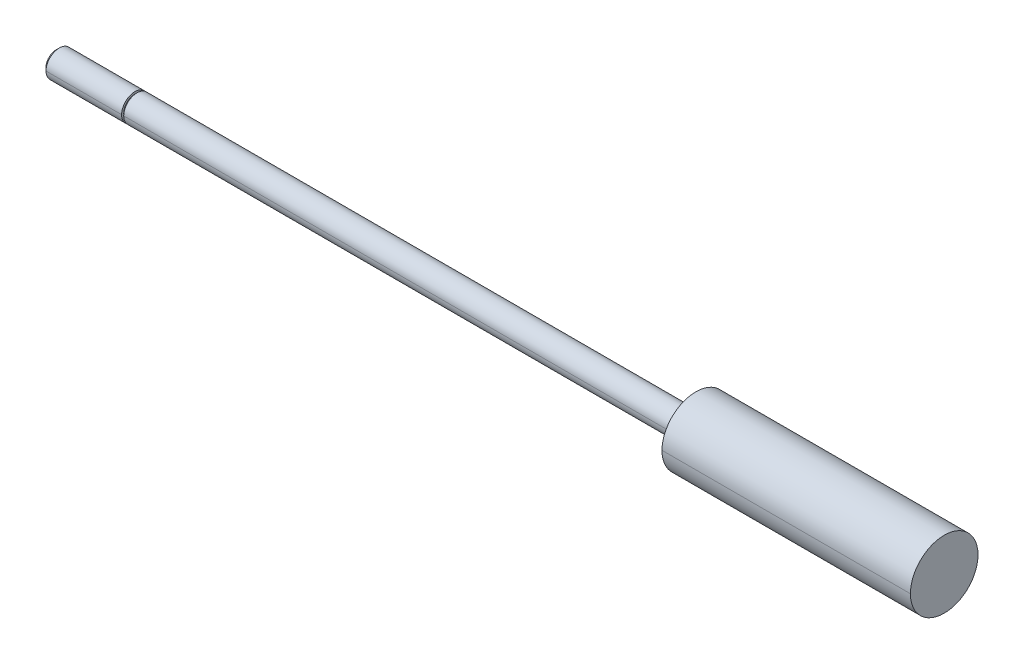
ISO-10303-21;
HEADER;
FILE_DESCRIPTION(('STEP AP214'),'2;1');
FILE_NAME('part.step','',(''),(''),'','','');
FILE_SCHEMA(('AUTOMOTIVE_DESIGN { 1 0 10303 214 1 1 1 1 }'));
ENDSEC;
DATA;
#1=APPLICATION_CONTEXT('core data for automotive mechanical design processes');
#2=APPLICATION_PROTOCOL_DEFINITION('international standard','automotive_design',2000,#1);
#3=PRODUCT_CONTEXT('',#1,'mechanical');
#4=PRODUCT('Part','Part','',(#3));
#5=PRODUCT_RELATED_PRODUCT_CATEGORY('part','',(#4));
#6=PRODUCT_DEFINITION_FORMATION('','',#4);
#7=PRODUCT_DEFINITION_CONTEXT('part definition',#1,'design');
#8=PRODUCT_DEFINITION('design','',#6,#7);
#9=PRODUCT_DEFINITION_SHAPE('','',#8);
#10=(LENGTH_UNIT() NAMED_UNIT(*) SI_UNIT(.MILLI.,.METRE.));
#11=(NAMED_UNIT(*) PLANE_ANGLE_UNIT() SI_UNIT($,.RADIAN.));
#12=(NAMED_UNIT(*) SI_UNIT($,.STERADIAN.) SOLID_ANGLE_UNIT());
#13=UNCERTAINTY_MEASURE_WITH_UNIT(LENGTH_MEASURE(1.E-05),#10,'distance_accuracy_value','');
#14=(GEOMETRIC_REPRESENTATION_CONTEXT(3) GLOBAL_UNCERTAINTY_ASSIGNED_CONTEXT((#13)) GLOBAL_UNIT_ASSIGNED_CONTEXT((#10,
#11,#12)) REPRESENTATION_CONTEXT('',''));
#15=CARTESIAN_POINT('',(0.,0.,0.));
#16=DIRECTION('',(0.,0.,1.));
#17=DIRECTION('',(1.,0.,0.));
#18=AXIS2_PLACEMENT_3D('',#15,#16,#17);
#19=CARTESIAN_POINT('',(0.,0.,0.));
#20=DIRECTION('',(-1.,0.,0.));
#21=DIRECTION('',(0.,-1.,0.));
#22=AXIS2_PLACEMENT_3D('',#19,#20,#21);
#23=CYLINDRICAL_SURFACE('',#22,1.3335);
#24=CARTESIAN_POINT('',(0.,0.,0.));
#25=DIRECTION('',(1.,0.,0.));
#26=DIRECTION('',(0.,0.,-1.));
#27=AXIS2_PLACEMENT_3D('',#24,#25,#26);
#28=CIRCLE('',#27,1.3335);
#29=CARTESIAN_POINT('',(0.,0.,-1.3335));
#30=VERTEX_POINT('',#29);
#31=CARTESIAN_POINT('',(0.,0.,1.3335));
#32=VERTEX_POINT('',#31);
#33=EDGE_CURVE('E11',#30,#32,#28,.T.);
#34=ORIENTED_EDGE('',*,*,#33,.F.);
#35=DIRECTION('',(-1.,0.,0.));
#36=VECTOR('',#35,1.);
#37=CARTESIAN_POINT('',(0.,0.,-1.3335));
#38=LINE('',#37,#36);
#39=CARTESIAN_POINT('',(-0.254,0.,-1.3335));
#40=VERTEX_POINT('',#39);
#41=EDGE_CURVE('E24',#30,#40,#38,.T.);
#42=ORIENTED_EDGE('',*,*,#41,.T.);
#43=CARTESIAN_POINT('',(-0.254,0.,0.));
#44=DIRECTION('',(1.,0.,0.));
#45=DIRECTION('',(0.,0.,-1.));
#46=AXIS2_PLACEMENT_3D('',#43,#44,#45);
#47=CIRCLE('',#46,1.3335);
#48=CARTESIAN_POINT('',(-0.254,0.,1.3335));
#49=VERTEX_POINT('',#48);
#50=EDGE_CURVE('E210',#40,#49,#47,.T.);
#51=ORIENTED_EDGE('',*,*,#50,.T.);
#52=DIRECTION('',(-1.,0.,0.));
#53=VECTOR('',#52,1.);
#54=CARTESIAN_POINT('',(0.,0.,1.3335));
#55=LINE('',#54,#53);
#56=EDGE_CURVE('E205',#32,#49,#55,.T.);
#57=ORIENTED_EDGE('',*,*,#56,.F.);
#58=EDGE_LOOP('',(#34,#42,#51,#57));
#59=FACE_BOUND('',#58,.T.);
#60=ADVANCED_FACE('F16',(#59),#23,.T.);
#61=CARTESIAN_POINT('',(0.,0.,0.));
#62=DIRECTION('',(-1.,0.,0.));
#63=DIRECTION('',(0.,1.,0.));
#64=AXIS2_PLACEMENT_3D('',#61,#62,#63);
#65=CYLINDRICAL_SURFACE('',#64,1.3335);
#66=CARTESIAN_POINT('',(-0.254,0.,0.));
#67=DIRECTION('',(1.,0.,0.));
#68=DIRECTION('',(0.,0.,-1.));
#69=AXIS2_PLACEMENT_3D('',#66,#67,#68);
#70=CIRCLE('',#69,1.3335);
#71=EDGE_CURVE('E201',#49,#40,#70,.T.);
#72=ORIENTED_EDGE('',*,*,#71,.T.);
#73=ORIENTED_EDGE('',*,*,#41,.F.);
#74=CARTESIAN_POINT('',(0.,0.,0.));
#75=DIRECTION('',(1.,0.,0.));
#76=DIRECTION('',(0.,0.,-1.));
#77=AXIS2_PLACEMENT_3D('',#74,#75,#76);
#78=CIRCLE('',#77,1.3335);
#79=EDGE_CURVE('E196',#32,#30,#78,.T.);
#80=ORIENTED_EDGE('',*,*,#79,.F.);
#81=ORIENTED_EDGE('',*,*,#56,.T.);
#82=EDGE_LOOP('',(#72,#73,#80,#81));
#83=FACE_BOUND('',#82,.T.);
#84=ADVANCED_FACE('F223',(#83),#65,.T.);
#85=CARTESIAN_POINT('',(0.,1.3335,0.));
#86=DIRECTION('',(1.,0.,0.));
#87=DIRECTION('',(0.,0.,-1.));
#88=AXIS2_PLACEMENT_3D('',#85,#86,#87);
#89=PLANE('',#88);
#90=CARTESIAN_POINT('',(0.,0.,0.));
#91=DIRECTION('',(1.,0.,0.));
#92=DIRECTION('',(0.,0.,-1.));
#93=AXIS2_PLACEMENT_3D('',#90,#91,#92);
#94=CIRCLE('',#93,1.5875);
#95=CARTESIAN_POINT('',(0.,0.,-1.5875));
#96=VERTEX_POINT('',#95);
#97=CARTESIAN_POINT('',(0.,0.,1.5875));
#98=VERTEX_POINT('',#97);
#99=EDGE_CURVE('E191',#96,#98,#94,.T.);
#100=ORIENTED_EDGE('',*,*,#99,.F.);
#101=CARTESIAN_POINT('',(0.,0.,0.));
#102=DIRECTION('',(1.,0.,0.));
#103=DIRECTION('',(0.,0.,-1.));
#104=AXIS2_PLACEMENT_3D('',#101,#102,#103);
#105=CIRCLE('',#104,1.5875);
#106=EDGE_CURVE('E186',#98,#96,#105,.T.);
#107=ORIENTED_EDGE('',*,*,#106,.F.);
#108=EDGE_LOOP('',(#100,#107));
#109=FACE_BOUND('',#108,.T.);
#110=ORIENTED_EDGE('',*,*,#33,.T.);
#111=ORIENTED_EDGE('',*,*,#79,.T.);
#112=EDGE_LOOP('',(#110,#111));
#113=FACE_BOUND('',#112,.T.);
#114=ADVANCED_FACE('F248',(#109,#113),#89,.F.);
#115=CARTESIAN_POINT('',(96.3168,0.,0.));
#116=DIRECTION('',(-1.,0.,0.));
#117=DIRECTION('',(0.,1.,0.));
#118=AXIS2_PLACEMENT_3D('',#115,#116,#117);
#119=CYLINDRICAL_SURFACE('',#118,1.5875);
#120=ORIENTED_EDGE('',*,*,#106,.T.);
#121=DIRECTION('',(-1.,0.,0.));
#122=VECTOR('',#121,1.);
#123=CARTESIAN_POINT('',(66.675,0.,-1.5875));
#124=LINE('',#123,#122);
#125=CARTESIAN_POINT('',(66.675,0.,-1.5875));
#126=VERTEX_POINT('',#125);
#127=EDGE_CURVE('E181',#126,#96,#124,.T.);
#128=ORIENTED_EDGE('',*,*,#127,.F.);
#129=CARTESIAN_POINT('',(66.675,0.,0.));
#130=DIRECTION('',(1.,0.,0.));
#131=DIRECTION('',(0.,0.,-1.));
#132=AXIS2_PLACEMENT_3D('',#129,#130,#131);
#133=CIRCLE('',#132,1.5875);
#134=CARTESIAN_POINT('',(66.675,0.,1.5875));
#135=VERTEX_POINT('',#134);
#136=EDGE_CURVE('E176',#135,#126,#133,.T.);
#137=ORIENTED_EDGE('',*,*,#136,.F.);
#138=DIRECTION('',(-1.,0.,0.));
#139=VECTOR('',#138,1.);
#140=CARTESIAN_POINT('',(66.675,0.,1.5875));
#141=LINE('',#140,#139);
#142=EDGE_CURVE('E171',#135,#98,#141,.T.);
#143=ORIENTED_EDGE('',*,*,#142,.T.);
#144=EDGE_LOOP('',(#120,#128,#137,#143));
#145=FACE_BOUND('',#144,.T.);
#146=ADVANCED_FACE('F252',(#145),#119,.T.);
#147=CARTESIAN_POINT('',(96.3168,0.,0.));
#148=DIRECTION('',(-1.,0.,0.));
#149=DIRECTION('',(0.,-1.,0.));
#150=AXIS2_PLACEMENT_3D('',#147,#148,#149);
#151=CYLINDRICAL_SURFACE('',#150,1.5875);
#152=CARTESIAN_POINT('',(66.675,0.,0.));
#153=DIRECTION('',(1.,0.,0.));
#154=DIRECTION('',(0.,0.,-1.));
#155=AXIS2_PLACEMENT_3D('',#152,#153,#154);
#156=CIRCLE('',#155,1.5875);
#157=EDGE_CURVE('E166',#126,#135,#156,.T.);
#158=ORIENTED_EDGE('',*,*,#157,.F.);
#159=ORIENTED_EDGE('',*,*,#127,.T.);
#160=ORIENTED_EDGE('',*,*,#99,.T.);
#161=ORIENTED_EDGE('',*,*,#142,.F.);
#162=EDGE_LOOP('',(#158,#159,#160,#161));
#163=FACE_BOUND('',#162,.T.);
#164=ADVANCED_FACE('F258',(#163),#151,.T.);
#165=CARTESIAN_POINT('',(66.675,1.5875,0.));
#166=DIRECTION('',(1.,0.,0.));
#167=DIRECTION('',(0.,0.,-1.));
#168=AXIS2_PLACEMENT_3D('',#165,#166,#167);
#169=PLANE('',#168);
#170=CARTESIAN_POINT('',(66.675,0.,0.));
#171=DIRECTION('',(1.,0.,0.));
#172=DIRECTION('',(0.,0.,-1.));
#173=AXIS2_PLACEMENT_3D('',#170,#171,#172);
#174=CIRCLE('',#173,4.03225);
#175=CARTESIAN_POINT('',(66.675,0.,-4.03225));
#176=VERTEX_POINT('',#175);
#177=CARTESIAN_POINT('',(66.675,0.,4.03225));
#178=VERTEX_POINT('',#177);
#179=EDGE_CURVE('E161',#176,#178,#174,.T.);
#180=ORIENTED_EDGE('',*,*,#179,.F.);
#181=CARTESIAN_POINT('',(66.675,0.,0.));
#182=DIRECTION('',(1.,0.,0.));
#183=DIRECTION('',(0.,0.,-1.));
#184=AXIS2_PLACEMENT_3D('',#181,#182,#183);
#185=CIRCLE('',#184,4.03225);
#186=EDGE_CURVE('E156',#178,#176,#185,.T.);
#187=ORIENTED_EDGE('',*,*,#186,.F.);
#188=EDGE_LOOP('',(#180,#187));
#189=FACE_BOUND('',#188,.T.);
#190=ORIENTED_EDGE('',*,*,#157,.T.);
#191=ORIENTED_EDGE('',*,*,#136,.T.);
#192=EDGE_LOOP('',(#190,#191));
#193=FACE_BOUND('',#192,.T.);
#194=ADVANCED_FACE('F262',(#189,#193),#169,.F.);
#195=CARTESIAN_POINT('',(96.3168,0.,0.));
#196=DIRECTION('',(-1.,0.,0.));
#197=DIRECTION('',(0.,1.,0.));
#198=AXIS2_PLACEMENT_3D('',#195,#196,#197);
#199=CYLINDRICAL_SURFACE('',#198,4.03225);
#200=ORIENTED_EDGE('',*,*,#186,.T.);
#201=DIRECTION('',(-1.,0.,0.));
#202=VECTOR('',#201,1.);
#203=CARTESIAN_POINT('',(96.3168,0.,-4.03225));
#204=LINE('',#203,#202);
#205=CARTESIAN_POINT('',(96.3168,0.,-4.03225));
#206=VERTEX_POINT('',#205);
#207=EDGE_CURVE('E151',#206,#176,#204,.T.);
#208=ORIENTED_EDGE('',*,*,#207,.F.);
#209=CARTESIAN_POINT('',(96.3168,0.,0.));
#210=DIRECTION('',(1.,0.,0.));
#211=DIRECTION('',(0.,0.,-1.));
#212=AXIS2_PLACEMENT_3D('',#209,#210,#211);
#213=CIRCLE('',#212,4.03225);
#214=CARTESIAN_POINT('',(96.3168,0.,4.03225));
#215=VERTEX_POINT('',#214);
#216=EDGE_CURVE('E146',#215,#206,#213,.T.);
#217=ORIENTED_EDGE('',*,*,#216,.F.);
#218=DIRECTION('',(-1.,0.,0.));
#219=VECTOR('',#218,1.);
#220=CARTESIAN_POINT('',(96.3168,0.,4.03225));
#221=LINE('',#220,#219);
#222=EDGE_CURVE('E141',#215,#178,#221,.T.);
#223=ORIENTED_EDGE('',*,*,#222,.T.);
#224=EDGE_LOOP('',(#200,#208,#217,#223));
#225=FACE_BOUND('',#224,.T.);
#226=ADVANCED_FACE('F266',(#225),#199,.T.);
#227=CARTESIAN_POINT('',(96.3168,0.,0.));
#228=DIRECTION('',(-1.,0.,0.));
#229=DIRECTION('',(0.,-1.,0.));
#230=AXIS2_PLACEMENT_3D('',#227,#228,#229);
#231=CYLINDRICAL_SURFACE('',#230,4.03225);
#232=CARTESIAN_POINT('',(96.3168,0.,0.));
#233=DIRECTION('',(1.,0.,0.));
#234=DIRECTION('',(0.,0.,-1.));
#235=AXIS2_PLACEMENT_3D('',#232,#233,#234);
#236=CIRCLE('',#235,4.03225);
#237=EDGE_CURVE('E136',#206,#215,#236,.T.);
#238=ORIENTED_EDGE('',*,*,#237,.F.);
#239=ORIENTED_EDGE('',*,*,#207,.T.);
#240=ORIENTED_EDGE('',*,*,#179,.T.);
#241=ORIENTED_EDGE('',*,*,#222,.F.);
#242=EDGE_LOOP('',(#238,#239,#240,#241));
#243=FACE_BOUND('',#242,.T.);
#244=ADVANCED_FACE('F270',(#243),#231,.T.);
#245=CARTESIAN_POINT('',(96.3168,4.03225,0.));
#246=DIRECTION('',(-1.,0.,0.));
#247=DIRECTION('',(0.,0.,1.));
#248=AXIS2_PLACEMENT_3D('',#245,#246,#247);
#249=PLANE('',#248);
#250=ORIENTED_EDGE('',*,*,#237,.T.);
#251=ORIENTED_EDGE('',*,*,#216,.T.);
#252=EDGE_LOOP('',(#250,#251));
#253=FACE_BOUND('',#252,.T.);
#254=ADVANCED_FACE('F228',(#253),#249,.F.);
#255=CARTESIAN_POINT('',(-0.254,1.8415,0.));
#256=DIRECTION('',(-1.,0.,0.));
#257=DIRECTION('',(0.,0.,1.));
#258=AXIS2_PLACEMENT_3D('',#255,#256,#257);
#259=PLANE('',#258);
#260=ORIENTED_EDGE('',*,*,#50,.F.);
#261=ORIENTED_EDGE('',*,*,#71,.F.);
#262=EDGE_LOOP('',(#260,#261));
#263=FACE_BOUND('',#262,.T.);
#264=CARTESIAN_POINT('',(-0.254000000000005,0.,0.));
#265=DIRECTION('',(-1.,0.,0.));
#266=DIRECTION('',(0.,0.,1.));
#267=AXIS2_PLACEMENT_3D('',#264,#265,#266);
#268=CIRCLE('',#267,1.5875);
#269=CARTESIAN_POINT('',(-0.254000000000005,0.,1.5875));
#270=VERTEX_POINT('',#269);
#271=CARTESIAN_POINT('',(-0.254000000000005,0.,-1.5875));
#272=VERTEX_POINT('',#271);
#273=EDGE_CURVE('E131',#270,#272,#268,.T.);
#274=ORIENTED_EDGE('',*,*,#273,.F.);
#275=CARTESIAN_POINT('',(-0.254000000000005,0.,0.));
#276=DIRECTION('',(-1.,0.,0.));
#277=DIRECTION('',(0.,0.,1.));
#278=AXIS2_PLACEMENT_3D('',#275,#276,#277);
#279=CIRCLE('',#278,1.5875);
#280=EDGE_CURVE('E126',#272,#270,#279,.T.);
#281=ORIENTED_EDGE('',*,*,#280,.F.);
#282=EDGE_LOOP('',(#274,#281));
#283=FACE_BOUND('',#282,.T.);
#284=ADVANCED_FACE('F224',(#263,#283),#259,.F.);
#285=CARTESIAN_POINT('',(96.3168,0.,0.));
#286=DIRECTION('',(-1.,0.,0.));
#287=DIRECTION('',(0.,1.,0.));
#288=AXIS2_PLACEMENT_3D('',#285,#286,#287);
#289=CYLINDRICAL_SURFACE('',#288,1.5875);
#290=CARTESIAN_POINT('',(-9.27354,0.,0.));
#291=DIRECTION('',(1.,0.,0.));
#292=DIRECTION('',(0.,0.,-1.));
#293=AXIS2_PLACEMENT_3D('',#290,#291,#292);
#294=CIRCLE('',#293,1.5875);
#295=CARTESIAN_POINT('',(-9.27354,0.,1.5875));
#296=VERTEX_POINT('',#295);
#297=CARTESIAN_POINT('',(-9.27354,0.,-1.5875));
#298=VERTEX_POINT('',#297);
#299=EDGE_CURVE('E97',#296,#298,#294,.T.);
#300=ORIENTED_EDGE('',*,*,#299,.T.);
#301=DIRECTION('',(-1.,0.,0.));
#302=VECTOR('',#301,1.);
#303=CARTESIAN_POINT('',(-0.254000000000005,0.,-1.5875));
#304=LINE('',#303,#302);
#305=EDGE_CURVE('E118',#272,#298,#304,.T.);
#306=ORIENTED_EDGE('',*,*,#305,.F.);
#307=ORIENTED_EDGE('',*,*,#280,.T.);
#308=DIRECTION('',(-1.,0.,0.));
#309=VECTOR('',#308,1.);
#310=CARTESIAN_POINT('',(-0.254000000000005,0.,1.5875));
#311=LINE('',#310,#309);
#312=EDGE_CURVE('E114',#270,#296,#311,.T.);
#313=ORIENTED_EDGE('',*,*,#312,.T.);
#314=EDGE_LOOP('',(#300,#306,#307,#313));
#315=FACE_BOUND('',#314,.T.);
#316=ADVANCED_FACE('F227',(#315),#289,.T.);
#317=CARTESIAN_POINT('',(96.3168,0.,0.));
#318=DIRECTION('',(-1.,0.,0.));
#319=DIRECTION('',(0.,-1.,0.));
#320=AXIS2_PLACEMENT_3D('',#317,#318,#319);
#321=CYLINDRICAL_SURFACE('',#320,1.5875);
#322=ORIENTED_EDGE('',*,*,#273,.T.);
#323=ORIENTED_EDGE('',*,*,#305,.T.);
#324=CARTESIAN_POINT('',(-9.27354,0.,0.));
#325=DIRECTION('',(1.,0.,0.));
#326=DIRECTION('',(0.,0.,-1.));
#327=AXIS2_PLACEMENT_3D('',#324,#325,#326);
#328=CIRCLE('',#327,1.5875);
#329=EDGE_CURVE('E109',#298,#296,#328,.T.);
#330=ORIENTED_EDGE('',*,*,#329,.T.);
#331=ORIENTED_EDGE('',*,*,#312,.F.);
#332=EDGE_LOOP('',(#322,#323,#330,#331));
#333=FACE_BOUND('',#332,.T.);
#334=ADVANCED_FACE('F234',(#333),#321,.T.);
#335=CARTESIAN_POINT('',(-9.652,0.,0.));
#336=DIRECTION('',(1.,0.,0.));
#337=DIRECTION('',(0.,-1.,0.));
#338=AXIS2_PLACEMENT_3D('',#335,#336,#337);
#339=CONICAL_SURFACE('',#338,1.20904,0.7853981634);
#340=ORIENTED_EDGE('',*,*,#329,.F.);
#341=DIRECTION('',(0.707106781184743,0.,-0.707106781188352));
#342=VECTOR('',#341,1.);
#343=CARTESIAN_POINT('',(-9.652,0.,-1.20904));
#344=LINE('',#343,#342);
#345=CARTESIAN_POINT('',(-9.652,0.,-1.20904));
#346=VERTEX_POINT('',#345);
#347=EDGE_CURVE('E89',#346,#298,#344,.T.);
#348=ORIENTED_EDGE('',*,*,#347,.F.);
#349=CARTESIAN_POINT('',(-9.652,0.,0.));
#350=DIRECTION('',(1.,0.,0.));
#351=DIRECTION('',(0.,0.,-1.));
#352=AXIS2_PLACEMENT_3D('',#349,#350,#351);
#353=CIRCLE('',#352,1.20904);
#354=CARTESIAN_POINT('',(-9.652,0.,1.20904));
#355=VERTEX_POINT('',#354);
#356=EDGE_CURVE('E82',#346,#355,#353,.T.);
#357=ORIENTED_EDGE('',*,*,#356,.T.);
#358=DIRECTION('',(0.707106781184743,0.,0.707106781188352));
#359=VECTOR('',#358,1.);
#360=CARTESIAN_POINT('',(-9.652,0.,1.20904));
#361=LINE('',#360,#359);
#362=EDGE_CURVE('E86',#355,#296,#361,.T.);
#363=ORIENTED_EDGE('',*,*,#362,.T.);
#364=EDGE_LOOP('',(#340,#348,#357,#363));
#365=FACE_BOUND('',#364,.T.);
#366=ADVANCED_FACE('F85',(#365),#339,.T.);
#367=CARTESIAN_POINT('',(-9.652,0.,0.));
#368=DIRECTION('',(1.,0.,0.));
#369=DIRECTION('',(0.,1.,0.));
#370=AXIS2_PLACEMENT_3D('',#367,#368,#369);
#371=CONICAL_SURFACE('',#370,1.20904,0.7853981634);
#372=CARTESIAN_POINT('',(-9.652,0.,0.));
#373=DIRECTION('',(1.,0.,0.));
#374=DIRECTION('',(0.,0.,-1.));
#375=AXIS2_PLACEMENT_3D('',#372,#373,#374);
#376=CIRCLE('',#375,1.20904);
#377=EDGE_CURVE('E96',#355,#346,#376,.T.);
#378=ORIENTED_EDGE('',*,*,#377,.T.);
#379=ORIENTED_EDGE('',*,*,#347,.T.);
#380=ORIENTED_EDGE('',*,*,#299,.F.);
#381=ORIENTED_EDGE('',*,*,#362,.F.);
#382=EDGE_LOOP('',(#378,#379,#380,#381));
#383=FACE_BOUND('',#382,.T.);
#384=ADVANCED_FACE('F95',(#383),#371,.T.);
#385=CARTESIAN_POINT('',(-9.652,0.,0.));
#386=DIRECTION('',(1.,0.,0.));
#387=DIRECTION('',(0.,0.,-1.));
#388=AXIS2_PLACEMENT_3D('',#385,#386,#387);
#389=PLANE('',#388);
#390=ORIENTED_EDGE('',*,*,#356,.F.);
#391=ORIENTED_EDGE('',*,*,#377,.F.);
#392=EDGE_LOOP('',(#390,#391));
#393=FACE_BOUND('',#392,.T.);
#394=ADVANCED_FACE('F99',(#393),#389,.F.);
#395=CLOSED_SHELL('',(#60,#84,#114,#146,#164,#194,#226,#244,#254,#284,#316,#334,#366,#384,#394));
#396=MANIFOLD_SOLID_BREP('B1',#395);
#397=ADVANCED_BREP_SHAPE_REPRESENTATION('',(#18,#396),#14);
#398=SHAPE_DEFINITION_REPRESENTATION(#9,#397);
ENDSEC;
END-ISO-10303-21;
